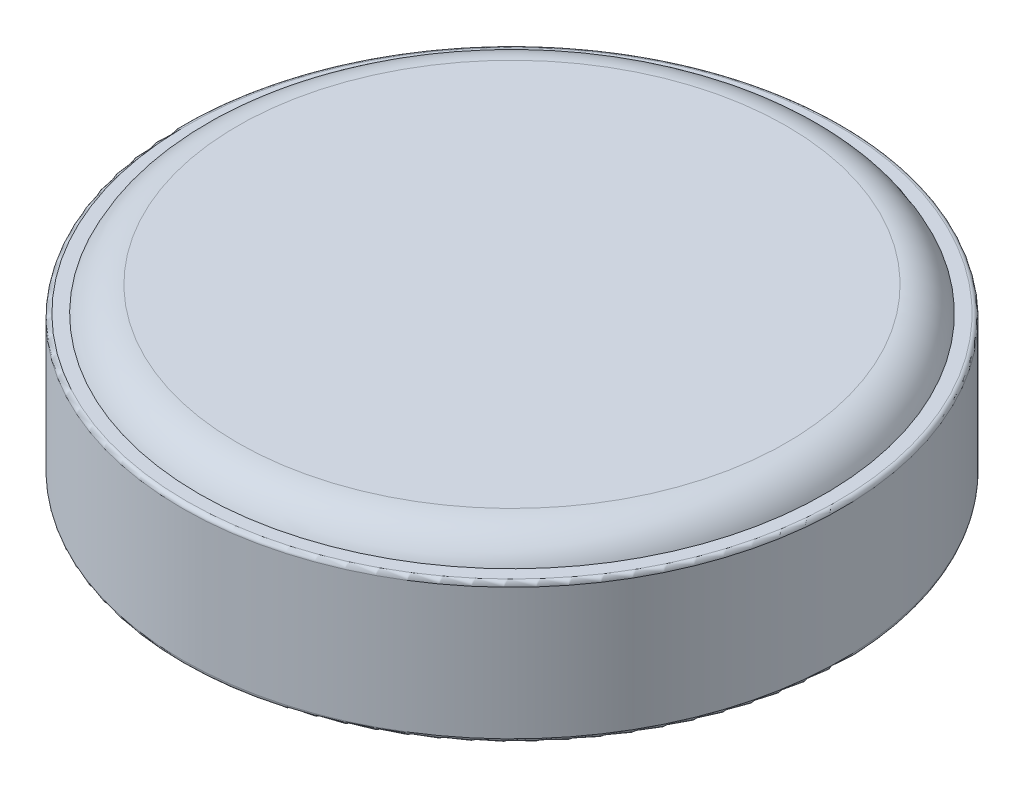
ISO-10303-21;
HEADER;
FILE_DESCRIPTION(('STEP AP214'),'2;1');
FILE_NAME('part.step','',(''),(''),'','','');
FILE_SCHEMA(('AUTOMOTIVE_DESIGN { 1 0 10303 214 1 1 1 1 }'));
ENDSEC;
DATA;
#1=APPLICATION_CONTEXT('core data for automotive mechanical design processes');
#2=APPLICATION_PROTOCOL_DEFINITION('international standard','automotive_design',2000,#1);
#3=PRODUCT_CONTEXT('',#1,'mechanical');
#4=PRODUCT('Part','Part','',(#3));
#5=PRODUCT_RELATED_PRODUCT_CATEGORY('part','',(#4));
#6=PRODUCT_DEFINITION_FORMATION('','',#4);
#7=PRODUCT_DEFINITION_CONTEXT('part definition',#1,'design');
#8=PRODUCT_DEFINITION('design','',#6,#7);
#9=PRODUCT_DEFINITION_SHAPE('','',#8);
#10=(LENGTH_UNIT() NAMED_UNIT(*) SI_UNIT(.MILLI.,.METRE.));
#11=(NAMED_UNIT(*) PLANE_ANGLE_UNIT() SI_UNIT($,.RADIAN.));
#12=(NAMED_UNIT(*) SI_UNIT($,.STERADIAN.) SOLID_ANGLE_UNIT());
#13=UNCERTAINTY_MEASURE_WITH_UNIT(LENGTH_MEASURE(1.E-05),#10,'distance_accuracy_value','');
#14=(GEOMETRIC_REPRESENTATION_CONTEXT(3) GLOBAL_UNCERTAINTY_ASSIGNED_CONTEXT((#13)) GLOBAL_UNIT_ASSIGNED_CONTEXT((#10,
#11,#12)) REPRESENTATION_CONTEXT('',''));
#15=CARTESIAN_POINT('',(0.,0.,0.));
#16=DIRECTION('',(0.,0.,1.));
#17=DIRECTION('',(1.,0.,0.));
#18=AXIS2_PLACEMENT_3D('',#15,#16,#17);
#19=CARTESIAN_POINT('',(0.,5.,0.));
#20=DIRECTION('',(0.,-1.,0.));
#21=DIRECTION('',(0.,0.,-1.));
#22=AXIS2_PLACEMENT_3D('',#19,#20,#21);
#23=CYLINDRICAL_SURFACE('',#22,10.);
#24=CARTESIAN_POINT('',(0.,0.127,0.));
#25=DIRECTION('',(0.,1.,0.));
#26=DIRECTION('',(0.,0.,1.));
#27=AXIS2_PLACEMENT_3D('',#24,#25,#26);
#28=CIRCLE('',#27,10.);
#29=CARTESIAN_POINT('',(0.,0.127,10.));
#30=VERTEX_POINT('',#29);
#31=EDGE_CURVE('E48',#30,#30,#28,.T.);
#32=ORIENTED_EDGE('',*,*,#31,.T.);
#33=EDGE_LOOP('',(#32));
#34=FACE_BOUND('',#33,.T.);
#35=CARTESIAN_POINT('',(0.,4.111,0.));
#36=DIRECTION('',(0.,1.,0.));
#37=DIRECTION('',(0.,0.,1.));
#38=AXIS2_PLACEMENT_3D('',#35,#36,#37);
#39=CIRCLE('',#38,10.);
#40=CARTESIAN_POINT('',(0.,4.111,10.));
#41=VERTEX_POINT('',#40);
#42=EDGE_CURVE('E52',#41,#41,#39,.F.);
#43=ORIENTED_EDGE('',*,*,#42,.T.);
#44=EDGE_LOOP('',(#43));
#45=FACE_BOUND('',#44,.T.);
#46=ADVANCED_FACE('F37',(#34,#45),#23,.T.);
#47=CARTESIAN_POINT('',(0.,0.,0.));
#48=DIRECTION('',(0.,1.,0.));
#49=DIRECTION('',(0.,0.,1.));
#50=AXIS2_PLACEMENT_3D('',#47,#48,#49);
#51=PLANE('',#50);
#52=CARTESIAN_POINT('',(0.,0.,0.));
#53=DIRECTION('',(0.,1.,0.));
#54=DIRECTION('',(0.,0.,1.));
#55=AXIS2_PLACEMENT_3D('',#52,#53,#54);
#56=CIRCLE('',#55,9.873);
#57=CARTESIAN_POINT('',(0.,0.,9.873));
#58=VERTEX_POINT('',#57);
#59=EDGE_CURVE('E44',#58,#58,#56,.F.);
#60=ORIENTED_EDGE('',*,*,#59,.T.);
#61=EDGE_LOOP('',(#60));
#62=FACE_BOUND('',#61,.T.);
#63=ADVANCED_FACE('F70',(#62),#51,.F.);
#64=CARTESIAN_POINT('',(0.,4.238,0.));
#65=DIRECTION('',(0.,1.,0.));
#66=DIRECTION('',(0.,0.,1.));
#67=AXIS2_PLACEMENT_3D('',#64,#65,#66);
#68=PLANE('',#67);
#69=CARTESIAN_POINT('',(0.,4.238,0.));
#70=DIRECTION('',(0.,1.,0.));
#71=DIRECTION('',(0.,0.,1.));
#72=AXIS2_PLACEMENT_3D('',#69,#70,#71);
#73=CIRCLE('',#72,9.873);
#74=CARTESIAN_POINT('',(0.,4.238,9.873));
#75=VERTEX_POINT('',#74);
#76=EDGE_CURVE('E10',#75,#75,#73,.T.);
#77=ORIENTED_EDGE('',*,*,#76,.T.);
#78=EDGE_LOOP('',(#77));
#79=FACE_BOUND('',#78,.T.);
#80=CARTESIAN_POINT('',(0.,4.238,0.));
#81=DIRECTION('',(0.,1.,0.));
#82=DIRECTION('',(0.,0.,1.));
#83=AXIS2_PLACEMENT_3D('',#80,#81,#82);
#84=CIRCLE('',#83,9.492);
#85=CARTESIAN_POINT('',(0.,4.238,9.492));
#86=VERTEX_POINT('',#85);
#87=EDGE_CURVE('E60',#86,#86,#84,.T.);
#88=ORIENTED_EDGE('',*,*,#87,.F.);
#89=EDGE_LOOP('',(#88));
#90=FACE_BOUND('',#89,.T.);
#91=ADVANCED_FACE('F67',(#79,#90),#68,.T.);
#92=CARTESIAN_POINT('',(0.,5.,0.));
#93=DIRECTION('',(0.,1.,0.));
#94=DIRECTION('',(0.,0.,1.));
#95=AXIS2_PLACEMENT_3D('',#92,#93,#94);
#96=PLANE('',#95);
#97=CARTESIAN_POINT('',(0.,5.,0.));
#98=DIRECTION('',(0.,1.,0.));
#99=DIRECTION('',(0.,0.,1.));
#100=AXIS2_PLACEMENT_3D('',#97,#98,#99);
#101=CIRCLE('',#100,8.32802577348122);
#102=CARTESIAN_POINT('',(0.,5.,8.32802577348122));
#103=VERTEX_POINT('',#102);
#104=EDGE_CURVE('E57',#103,#103,#101,.T.);
#105=ORIENTED_EDGE('',*,*,#104,.T.);
#106=EDGE_LOOP('',(#105));
#107=FACE_BOUND('',#106,.T.);
#108=ADVANCED_FACE('F69',(#107),#96,.T.);
#109=CARTESIAN_POINT('',(0.,3.73,0.));
#110=DIRECTION('',(0.,-1.,0.));
#111=DIRECTION('',(0.,0.,-1.));
#112=AXIS2_PLACEMENT_3D('',#109,#110,#111);
#113=TOROIDAL_SURFACE('',#112,8.32802577348122,1.27);
#114=ORIENTED_EDGE('',*,*,#87,.T.);
#115=EDGE_LOOP('',(#114));
#116=FACE_BOUND('',#115,.T.);
#117=ORIENTED_EDGE('',*,*,#104,.F.);
#118=EDGE_LOOP('',(#117));
#119=FACE_BOUND('',#118,.T.);
#120=ADVANCED_FACE('F64',(#116,#119),#113,.T.);
#121=CARTESIAN_POINT('',(0.,0.127,0.));
#122=DIRECTION('',(0.,1.,0.));
#123=DIRECTION('',(0.,0.,1.));
#124=AXIS2_PLACEMENT_3D('',#121,#122,#123);
#125=TOROIDAL_SURFACE('',#124,9.873,0.127);
#126=ORIENTED_EDGE('',*,*,#59,.F.);
#127=EDGE_LOOP('',(#126));
#128=FACE_BOUND('',#127,.T.);
#129=ORIENTED_EDGE('',*,*,#31,.F.);
#130=EDGE_LOOP('',(#129));
#131=FACE_BOUND('',#130,.T.);
#132=ADVANCED_FACE('F88',(#128,#131),#125,.T.);
#133=CARTESIAN_POINT('',(0.,4.111,0.));
#134=DIRECTION('',(0.,1.,0.));
#135=DIRECTION('',(0.,0.,1.));
#136=AXIS2_PLACEMENT_3D('',#133,#134,#135);
#137=TOROIDAL_SURFACE('',#136,9.873,0.127);
#138=ORIENTED_EDGE('',*,*,#42,.F.);
#139=EDGE_LOOP('',(#138));
#140=FACE_BOUND('',#139,.T.);
#141=ORIENTED_EDGE('',*,*,#76,.F.);
#142=EDGE_LOOP('',(#141));
#143=FACE_BOUND('',#142,.T.);
#144=ADVANCED_FACE('F39',(#140,#143),#137,.T.);
#145=CLOSED_SHELL('',(#46,#63,#91,#108,#120,#132,#144));
#146=MANIFOLD_SOLID_BREP('B2',#145);
#147=ADVANCED_BREP_SHAPE_REPRESENTATION('',(#18,#146),#14);
#148=SHAPE_DEFINITION_REPRESENTATION(#9,#147);
ENDSEC;
END-ISO-10303-21;
